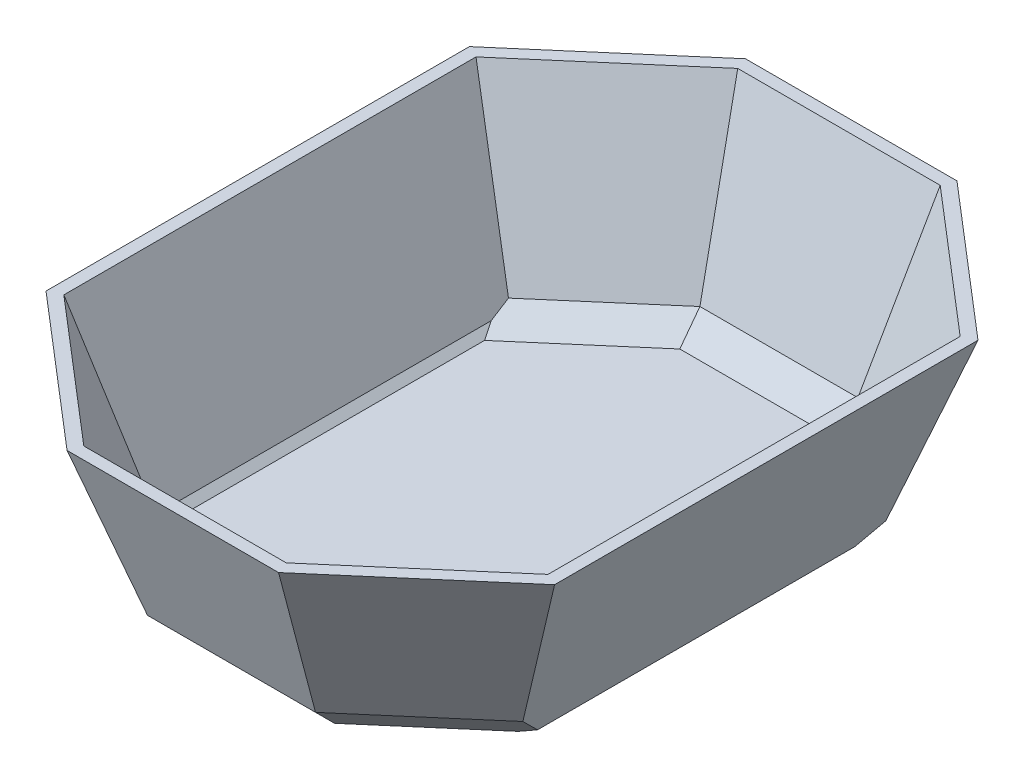
ISO-10303-21;
HEADER;
FILE_DESCRIPTION(('STEP AP214'),'2;1');
FILE_NAME('part.step','',(''),(''),'','','');
FILE_SCHEMA(('AUTOMOTIVE_DESIGN { 1 0 10303 214 1 1 1 1 }'));
ENDSEC;
DATA;
#1=APPLICATION_CONTEXT('core data for automotive mechanical design processes');
#2=APPLICATION_PROTOCOL_DEFINITION('international standard','automotive_design',2000,#1);
#3=PRODUCT_CONTEXT('',#1,'mechanical');
#4=PRODUCT('Part','Part','',(#3));
#5=PRODUCT_RELATED_PRODUCT_CATEGORY('part','',(#4));
#6=PRODUCT_DEFINITION_FORMATION('','',#4);
#7=PRODUCT_DEFINITION_CONTEXT('part definition',#1,'design');
#8=PRODUCT_DEFINITION('design','',#6,#7);
#9=PRODUCT_DEFINITION_SHAPE('','',#8);
#10=(LENGTH_UNIT() NAMED_UNIT(*) SI_UNIT(.MILLI.,.METRE.));
#11=(NAMED_UNIT(*) PLANE_ANGLE_UNIT() SI_UNIT($,.RADIAN.));
#12=(NAMED_UNIT(*) SI_UNIT($,.STERADIAN.) SOLID_ANGLE_UNIT());
#13=UNCERTAINTY_MEASURE_WITH_UNIT(LENGTH_MEASURE(1.E-05),#10,'distance_accuracy_value','');
#14=(GEOMETRIC_REPRESENTATION_CONTEXT(3) GLOBAL_UNCERTAINTY_ASSIGNED_CONTEXT((#13)) GLOBAL_UNIT_ASSIGNED_CONTEXT((#10,
#11,#12)) REPRESENTATION_CONTEXT('',''));
#15=CARTESIAN_POINT('',(0.,0.,0.));
#16=DIRECTION('',(0.,0.,1.));
#17=DIRECTION('',(1.,0.,0.));
#18=AXIS2_PLACEMENT_3D('',#15,#16,#17);
#19=CARTESIAN_POINT('',(0.,50.,0.));
#20=DIRECTION('',(0.,1.,0.));
#21=DIRECTION('',(0.,0.,1.));
#22=AXIS2_PLACEMENT_3D('',#19,#20,#21);
#23=PLANE('',#22);
#24=DIRECTION('',(0.,0.,1.));
#25=VECTOR('',#24,1.);
#26=CARTESIAN_POINT('',(66.4232600357115,50.,0.));
#27=LINE('',#26,#25);
#28=CARTESIAN_POINT('',(66.4232600357115,50.,-55.2960015343811));
#29=VERTEX_POINT('',#28);
#30=CARTESIAN_POINT('',(66.4232600357115,50.,55.296001534381));
#31=VERTEX_POINT('',#30);
#32=EDGE_CURVE('E354',#29,#31,#27,.T.);
#33=ORIENTED_EDGE('',*,*,#32,.F.);
#34=DIRECTION('',(0.75883467283237,0.,0.65128330187975));
#35=VECTOR('',#34,1.);
#36=CARTESIAN_POINT('',(55.5029382979195,50.,-64.6685611361081));
#37=LINE('',#36,#35);
#38=CARTESIAN_POINT('',(27.6218108773244,50.,-88.5980327018157));
#39=VERTEX_POINT('',#38);
#40=EDGE_CURVE('E358',#39,#29,#37,.T.);
#41=ORIENTED_EDGE('',*,*,#40,.F.);
#42=DIRECTION('',(1.,0.,0.));
#43=VECTOR('',#42,1.);
#44=CARTESIAN_POINT('',(0.,50.,-88.5980327018157));
#45=LINE('',#44,#43);
#46=CARTESIAN_POINT('',(-27.6218108773244,50.,-88.5980327018157));
#47=VERTEX_POINT('',#46);
#48=EDGE_CURVE('E363',#47,#39,#45,.T.);
#49=ORIENTED_EDGE('',*,*,#48,.F.);
#50=DIRECTION('',(0.75883467283237,0.,-0.65128330187975));
#51=VECTOR('',#50,1.);
#52=CARTESIAN_POINT('',(-55.5029382979195,50.,-64.6685611361081));
#53=LINE('',#52,#51);
#54=CARTESIAN_POINT('',(-66.4232600357115,50.,-55.2960015343811));
#55=VERTEX_POINT('',#54);
#56=EDGE_CURVE('E367',#55,#47,#53,.T.);
#57=ORIENTED_EDGE('',*,*,#56,.F.);
#58=DIRECTION('',(0.,0.,-1.));
#59=VECTOR('',#58,1.);
#60=CARTESIAN_POINT('',(-66.4232600357115,50.,0.));
#61=LINE('',#60,#59);
#62=CARTESIAN_POINT('',(-66.4232600357115,50.,55.296001534381));
#63=VERTEX_POINT('',#62);
#64=EDGE_CURVE('E349',#55,#63,#61,.F.);
#65=ORIENTED_EDGE('',*,*,#64,.T.);
#66=DIRECTION('',(-0.758834672832369,0.,-0.651283301879752));
#67=VECTOR('',#66,1.);
#68=CARTESIAN_POINT('',(-55.5029382979196,50.,64.6685611361079));
#69=LINE('',#68,#67);
#70=CARTESIAN_POINT('',(-27.6218108773245,50.,88.5980327018156));
#71=VERTEX_POINT('',#70);
#72=EDGE_CURVE('E345',#63,#71,#69,.F.);
#73=ORIENTED_EDGE('',*,*,#72,.T.);
#74=DIRECTION('',(-1.,0.,0.));
#75=VECTOR('',#74,1.);
#76=CARTESIAN_POINT('',(0.,50.,88.5980327018156));
#77=LINE('',#76,#75);
#78=CARTESIAN_POINT('',(27.6218108773244,50.,88.5980327018157));
#79=VERTEX_POINT('',#78);
#80=EDGE_CURVE('E348',#71,#79,#77,.F.);
#81=ORIENTED_EDGE('',*,*,#80,.T.);
#82=DIRECTION('',(-0.75883467283237,0.,0.65128330187975));
#83=VECTOR('',#82,1.);
#84=CARTESIAN_POINT('',(55.5029382979195,50.,64.668561136108));
#85=LINE('',#84,#83);
#86=EDGE_CURVE('E341',#79,#31,#85,.F.);
#87=ORIENTED_EDGE('',*,*,#86,.T.);
#88=EDGE_LOOP('',(#33,#41,#49,#57,#65,#73,#81,#87));
#89=FACE_BOUND('',#88,.T.);
#90=DIRECTION('',(0.75883467283237,0.,0.65128330187975));
#91=VECTOR('',#90,1.);
#92=CARTESIAN_POINT('',(53.4236946575841,50.,-62.2459561606714));
#93=LINE('',#92,#91);
#94=CARTESIAN_POINT('',(26.4396397088501,50.,-85.405499384388));
#95=VERTEX_POINT('',#94);
#96=CARTESIAN_POINT('',(63.2307267182838,50.,-53.8288971479449));
#97=VERTEX_POINT('',#96);
#98=EDGE_CURVE('E285',#95,#97,#93,.T.);
#99=ORIENTED_EDGE('',*,*,#98,.T.);
#100=DIRECTION('',(0.,0.,1.));
#101=VECTOR('',#100,1.);
#102=CARTESIAN_POINT('',(63.2307267182838,50.,0.));
#103=LINE('',#102,#101);
#104=CARTESIAN_POINT('',(63.2307267182838,50.,53.8288971479448));
#105=VERTEX_POINT('',#104);
#106=EDGE_CURVE('E281',#97,#105,#103,.T.);
#107=ORIENTED_EDGE('',*,*,#106,.T.);
#108=DIRECTION('',(-0.75883467283237,0.,0.65128330187975));
#109=VECTOR('',#108,1.);
#110=CARTESIAN_POINT('',(53.423694657584,50.,62.2459561606713));
#111=LINE('',#110,#109);
#112=CARTESIAN_POINT('',(26.43963970885,50.,85.4054993843879));
#113=VERTEX_POINT('',#112);
#114=EDGE_CURVE('E307',#113,#105,#111,.F.);
#115=ORIENTED_EDGE('',*,*,#114,.F.);
#116=DIRECTION('',(-1.,0.,0.));
#117=VECTOR('',#116,1.);
#118=CARTESIAN_POINT('',(0.,50.,85.4054993843879));
#119=LINE('',#118,#117);
#120=CARTESIAN_POINT('',(-26.4396397088501,50.,85.4054993843879));
#121=VERTEX_POINT('',#120);
#122=EDGE_CURVE('E304',#121,#113,#119,.F.);
#123=ORIENTED_EDGE('',*,*,#122,.F.);
#124=DIRECTION('',(-0.758834672832369,0.,-0.651283301879752));
#125=VECTOR('',#124,1.);
#126=CARTESIAN_POINT('',(-53.4236946575841,50.,62.2459561606712));
#127=LINE('',#126,#125);
#128=CARTESIAN_POINT('',(-63.2307267182838,50.,53.8288971479447));
#129=VERTEX_POINT('',#128);
#130=EDGE_CURVE('E301',#129,#121,#127,.F.);
#131=ORIENTED_EDGE('',*,*,#130,.F.);
#132=DIRECTION('',(0.,0.,-1.));
#133=VECTOR('',#132,1.);
#134=CARTESIAN_POINT('',(-63.2307267182838,50.,0.));
#135=LINE('',#134,#133);
#136=CARTESIAN_POINT('',(-63.2307267182838,50.,-53.8288971479449));
#137=VERTEX_POINT('',#136);
#138=EDGE_CURVE('E298',#137,#129,#135,.F.);
#139=ORIENTED_EDGE('',*,*,#138,.F.);
#140=DIRECTION('',(0.75883467283237,0.,-0.65128330187975));
#141=VECTOR('',#140,1.);
#142=CARTESIAN_POINT('',(-53.4236946575841,50.,-62.2459561606714));
#143=LINE('',#142,#141);
#144=CARTESIAN_POINT('',(-26.4396397088501,50.,-85.405499384388));
#145=VERTEX_POINT('',#144);
#146=EDGE_CURVE('E294',#137,#145,#143,.T.);
#147=ORIENTED_EDGE('',*,*,#146,.T.);
#148=DIRECTION('',(1.,0.,0.));
#149=VECTOR('',#148,1.);
#150=CARTESIAN_POINT('',(0.,50.,-85.405499384388));
#151=LINE('',#150,#149);
#152=EDGE_CURVE('E290',#145,#95,#151,.T.);
#153=ORIENTED_EDGE('',*,*,#152,.T.);
#154=EDGE_LOOP('',(#99,#107,#115,#123,#131,#139,#147,#153));
#155=FACE_BOUND('',#154,.T.);
#156=ADVANCED_FACE('F47',(#89,#155),#23,.T.);
#157=CARTESIAN_POINT('',(48.2247483224014,0.,0.));
#158=DIRECTION('',(0.939692620785908,-0.342020143325669,0.));
#159=DIRECTION('',(0.342020143325669,0.939692620785908,0.));
#160=AXIS2_PLACEMENT_3D('',#157,#158,#159);
#161=PLANE('',#160);
#162=DIRECTION('',(-0.248610057653061,-0.683050519651096,-0.686756890637516));
#163=VECTOR('',#162,1.);
#164=CARTESIAN_POINT('',(41.3366350263839,-18.9249357434531,21.316337174256));
#165=LINE('',#164,#163);
#166=CARTESIAN_POINT('',(51.0860156236753,7.86126730127392,48.2478876024416));
#167=VERTEX_POINT('',#166);
#168=CARTESIAN_POINT('',(48.9087886090527,1.87938524157184,42.233546634544));
#169=VERTEX_POINT('',#168);
#170=EDGE_CURVE('E392',#167,#169,#165,.T.);
#171=ORIENTED_EDGE('',*,*,#170,.T.);
#172=DIRECTION('',(0.,0.,-1.));
#173=VECTOR('',#172,1.);
#174=CARTESIAN_POINT('',(48.9087886090527,1.87938524157184,-35.9084967621453));
#175=LINE('',#174,#173);
#176=CARTESIAN_POINT('',(48.9087886090527,1.87938524157185,-40.6326491614614));
#177=VERTEX_POINT('',#176);
#178=EDGE_CURVE('E57',#169,#177,#175,.T.);
#179=ORIENTED_EDGE('',*,*,#178,.T.);
#180=DIRECTION('',(0.133339372895486,0.366346916154587,-0.920874882196198));
#181=VECTOR('',#180,1.);
#182=CARTESIAN_POINT('',(43.8155842473697,-12.1140787348201,-5.45771272132757));
#183=LINE('',#182,#181);
#184=CARTESIAN_POINT('',(49.9348490390297,4.69846310392956,-47.7188777604354));
#185=VERTEX_POINT('',#184);
#186=EDGE_CURVE('E395',#177,#185,#183,.T.);
#187=ORIENTED_EDGE('',*,*,#186,.T.);
#188=DIRECTION('',(-0.337872326797718,-0.928296588535319,0.155266656104858));
#189=VECTOR('',#188,1.);
#190=CARTESIAN_POINT('',(47.9085216457583,-0.868825653506048,-46.7876944300074));
#191=LINE('',#190,#189);
#192=EDGE_CURVE('E332',#29,#185,#191,.T.);
#193=ORIENTED_EDGE('',*,*,#192,.F.);
#194=ORIENTED_EDGE('',*,*,#32,.T.);
#195=DIRECTION('',(0.337872326797717,0.928296588535319,0.155266656104858));
#196=VECTOR('',#195,1.);
#197=CARTESIAN_POINT('',(47.9085216457583,-0.868825653506054,46.7876944300073));
#198=LINE('',#197,#196);
#199=EDGE_CURVE('E337',#31,#167,#198,.F.);
#200=ORIENTED_EDGE('',*,*,#199,.T.);
#201=EDGE_LOOP('',(#171,#179,#187,#193,#194,#200));
#202=FACE_BOUND('',#201,.T.);
#203=ADVANCED_FACE('F462',(#202),#161,.T.);
#204=CARTESIAN_POINT('',(43.6505514999776,0.,-50.8588994541023));
#205=DIRECTION('',(0.612006112817482,-0.342020143325669,-0.713071342457067));
#206=DIRECTION('',(-0.75883467283237,0.,-0.65128330187975));
#207=AXIS2_PLACEMENT_3D('',#204,#205,#206);
#208=PLANE('',#207);
#209=ORIENTED_EDGE('',*,*,#192,.T.);
#210=DIRECTION('',(-0.75883467283237,0.,-0.65128330187975));
#211=VECTOR('',#210,1.);
#212=CARTESIAN_POINT('',(21.9967983773125,4.69846310392955,-71.6972047063186));
#213=LINE('',#212,#211);
#214=CARTESIAN_POINT('',(21.5162758190599,4.69846310392956,-72.1096217051339));
#215=VERTEX_POINT('',#214);
#216=EDGE_CURVE('E398',#185,#215,#213,.T.);
#217=ORIENTED_EDGE('',*,*,#216,.T.);
#218=DIRECTION('',(-0.125643867089277,-0.932245941820491,0.339309773838121));
#219=VECTOR('',#218,1.);
#220=CARTESIAN_POINT('',(20.5533707293889,-2.44605085444957,-69.5092312859845));
#221=LINE('',#220,#219);
#222=EDGE_CURVE('E328',#39,#215,#221,.T.);
#223=ORIENTED_EDGE('',*,*,#222,.F.);
#224=ORIENTED_EDGE('',*,*,#40,.T.);
#225=EDGE_LOOP('',(#209,#217,#223,#224));
#226=FACE_BOUND('',#225,.T.);
#227=ADVANCED_FACE('F479',(#226),#208,.T.);
#228=CARTESIAN_POINT('',(0.,0.,-70.3995209885055));
#229=DIRECTION('',(0.,-0.342020143325669,-0.939692620785908));
#230=DIRECTION('',(0.,0.939692620785908,-0.342020143325669));
#231=AXIS2_PLACEMENT_3D('',#228,#229,#230);
#232=PLANE('',#231);
#233=ORIENTED_EDGE('',*,*,#222,.T.);
#234=DIRECTION('',(-1.,0.,0.));
#235=VECTOR('',#234,1.);
#236=CARTESIAN_POINT('',(-20.8830383360399,4.69846310392956,-72.1096217051339));
#237=LINE('',#236,#235);
#238=CARTESIAN_POINT('',(-21.5162758190599,4.69846310392956,-72.1096217051339));
#239=VERTEX_POINT('',#238);
#240=EDGE_CURVE('E401',#215,#239,#237,.T.);
#241=ORIENTED_EDGE('',*,*,#240,.T.);
#242=DIRECTION('',(0.125643867089277,-0.932245941820491,0.339309773838121));
#243=VECTOR('',#242,1.);
#244=CARTESIAN_POINT('',(-20.4093954494241,-3.51431127637887,-69.1204162899576));
#245=LINE('',#244,#243);
#246=EDGE_CURVE('E324',#47,#239,#245,.T.);
#247=ORIENTED_EDGE('',*,*,#246,.F.);
#248=ORIENTED_EDGE('',*,*,#48,.T.);
#249=EDGE_LOOP('',(#233,#241,#247,#248));
#250=FACE_BOUND('',#249,.T.);
#251=ADVANCED_FACE('F482',(#250),#232,.T.);
#252=CARTESIAN_POINT('',(-43.6505514999776,0.,-50.8588994541023));
#253=DIRECTION('',(-0.612006112817482,-0.342020143325669,-0.713071342457067));
#254=DIRECTION('',(-0.75883467283237,0.,0.65128330187975));
#255=AXIS2_PLACEMENT_3D('',#252,#253,#254);
#256=PLANE('',#255);
#257=ORIENTED_EDGE('',*,*,#246,.T.);
#258=DIRECTION('',(-0.75883467283237,0.,0.65128330187975));
#259=VECTOR('',#258,1.);
#260=CARTESIAN_POINT('',(-49.338508363674,4.69846310392956,-48.2306977101501));
#261=LINE('',#260,#259);
#262=CARTESIAN_POINT('',(-49.9348490390297,4.69846310392956,-47.7188777604354));
#263=VERTEX_POINT('',#262);
#264=EDGE_CURVE('E404',#239,#263,#261,.T.);
#265=ORIENTED_EDGE('',*,*,#264,.T.);
#266=DIRECTION('',(-0.337872326797718,0.928296588535319,-0.155266656104858));
#267=VECTOR('',#266,1.);
#268=CARTESIAN_POINT('',(-47.9085216457583,-0.868825653506048,-46.7876944300074));
#269=LINE('',#268,#267);
#270=EDGE_CURVE('E320',#55,#263,#269,.F.);
#271=ORIENTED_EDGE('',*,*,#270,.F.);
#272=ORIENTED_EDGE('',*,*,#56,.T.);
#273=EDGE_LOOP('',(#257,#265,#271,#272));
#274=FACE_BOUND('',#273,.T.);
#275=ADVANCED_FACE('F489',(#274),#256,.T.);
#276=CARTESIAN_POINT('',(-48.2247483224014,0.,0.));
#277=DIRECTION('',(-0.939692620785908,-0.342020143325669,0.));
#278=DIRECTION('',(0.342020143325669,-0.939692620785908,0.));
#279=AXIS2_PLACEMENT_3D('',#276,#277,#278);
#280=PLANE('',#279);
#281=DIRECTION('',(-0.133339372895486,0.366346916154587,-0.920874882196198));
#282=VECTOR('',#281,1.);
#283=CARTESIAN_POINT('',(-49.1027998441334,2.41242672907649,-41.9725390182232));
#284=LINE('',#283,#282);
#285=CARTESIAN_POINT('',(-49.3692552429109,3.14450692050958,-43.8127462925753));
#286=VERTEX_POINT('',#285);
#287=EDGE_CURVE('E410',#263,#286,#284,.F.);
#288=ORIENTED_EDGE('',*,*,#287,.T.);
#289=DIRECTION('',(0.,0.,-1.));
#290=VECTOR('',#289,1.);
#291=CARTESIAN_POINT('',(-49.3692552429109,3.14450692050958,0.));
#292=LINE('',#291,#290);
#293=CARTESIAN_POINT('',(-49.3692552429109,3.14450692050958,43.5055331209157));
#294=VERTEX_POINT('',#293);
#295=EDGE_CURVE('E424',#286,#294,#292,.F.);
#296=ORIENTED_EDGE('',*,*,#295,.T.);
#297=DIRECTION('',(0.248610057653061,-0.683050519651096,-0.686756890637516));
#298=VECTOR('',#297,1.);
#299=CARTESIAN_POINT('',(-51.5581234712822,9.15837295212142,49.5520316122571));
#300=LINE('',#299,#298);
#301=CARTESIAN_POINT('',(-51.0860156236753,7.86126730127393,48.2478876024416));
#302=VERTEX_POINT('',#301);
#303=EDGE_CURVE('E407',#294,#302,#300,.F.);
#304=ORIENTED_EDGE('',*,*,#303,.T.);
#305=DIRECTION('',(0.337872326797718,-0.92829658853532,-0.155266656104858));
#306=VECTOR('',#305,1.);
#307=CARTESIAN_POINT('',(-47.9085216457583,-0.868825653506038,46.7876944300073));
#308=LINE('',#307,#306);
#309=EDGE_CURVE('E315',#63,#302,#308,.T.);
#310=ORIENTED_EDGE('',*,*,#309,.F.);
#311=ORIENTED_EDGE('',*,*,#64,.F.);
#312=ORIENTED_EDGE('',*,*,#270,.T.);
#313=EDGE_LOOP('',(#288,#296,#304,#310,#311,#312));
#314=FACE_BOUND('',#313,.T.);
#315=ADVANCED_FACE('F495',(#314),#280,.T.);
#316=CARTESIAN_POINT('',(-43.6505514999776,0.,50.8588994541022));
#317=DIRECTION('',(-0.612006112817484,-0.342020143325669,0.713071342457066));
#318=DIRECTION('',(0.758834672832369,0.,0.651283301879752));
#319=AXIS2_PLACEMENT_3D('',#316,#317,#318);
#320=PLANE('',#319);
#321=ORIENTED_EDGE('',*,*,#309,.T.);
#322=DIRECTION('',(-0.758834672832369,0.,-0.651283301879752));
#323=VECTOR('',#322,1.);
#324=CARTESIAN_POINT('',(-45.5140471155119,7.86126730127393,53.0301282905503));
#325=LINE('',#324,#323);
#326=CARTESIAN_POINT('',(-21.9425441806304,7.86126730127394,73.2607882897794));
#327=VERTEX_POINT('',#326);
#328=EDGE_CURVE('E414',#302,#327,#325,.F.);
#329=ORIENTED_EDGE('',*,*,#328,.T.);
#330=DIRECTION('',(0.125643867089278,-0.932245941820491,-0.339309773838121));
#331=VECTOR('',#330,1.);
#332=CARTESIAN_POINT('',(-20.5533707293889,-2.44605085444957,69.5092312859844));
#333=LINE('',#332,#331);
#334=EDGE_CURVE('E311',#71,#327,#333,.T.);
#335=ORIENTED_EDGE('',*,*,#334,.F.);
#336=ORIENTED_EDGE('',*,*,#72,.F.);
#337=EDGE_LOOP('',(#321,#329,#335,#336));
#338=FACE_BOUND('',#337,.T.);
#339=ADVANCED_FACE('F501',(#338),#320,.T.);
#340=CARTESIAN_POINT('',(0.,0.,70.3995209885055));
#341=DIRECTION('',(0.,-0.342020143325669,0.939692620785908));
#342=DIRECTION('',(0.,-0.939692620785908,-0.342020143325669));
#343=AXIS2_PLACEMENT_3D('',#340,#341,#342);
#344=PLANE('',#343);
#345=ORIENTED_EDGE('',*,*,#334,.T.);
#346=DIRECTION('',(-1.,0.,0.));
#347=VECTOR('',#346,1.);
#348=CARTESIAN_POINT('',(0.,7.86126730127394,73.2607882897794));
#349=LINE('',#348,#347);
#350=CARTESIAN_POINT('',(21.9425441806303,7.86126730127392,73.2607882897794));
#351=VERTEX_POINT('',#350);
#352=EDGE_CURVE('E418',#327,#351,#349,.F.);
#353=ORIENTED_EDGE('',*,*,#352,.T.);
#354=DIRECTION('',(-0.125643867089277,-0.932245941820491,-0.339309773838121));
#355=VECTOR('',#354,1.);
#356=CARTESIAN_POINT('',(20.4093954494241,-3.51431127637887,69.1204162899575));
#357=LINE('',#356,#355);
#358=EDGE_CURVE('E316',#79,#351,#357,.T.);
#359=ORIENTED_EDGE('',*,*,#358,.F.);
#360=ORIENTED_EDGE('',*,*,#80,.F.);
#361=EDGE_LOOP('',(#345,#353,#359,#360));
#362=FACE_BOUND('',#361,.T.);
#363=ADVANCED_FACE('F504',(#362),#344,.T.);
#364=CARTESIAN_POINT('',(43.6505514999775,0.,50.8588994541023));
#365=DIRECTION('',(0.612006112817483,-0.342020143325669,0.713071342457067));
#366=DIRECTION('',(0.75883467283237,0.,-0.65128330187975));
#367=AXIS2_PLACEMENT_3D('',#364,#365,#366);
#368=PLANE('',#367);
#369=ORIENTED_EDGE('',*,*,#358,.T.);
#370=DIRECTION('',(-0.75883467283237,0.,0.651283301879751));
#371=VECTOR('',#370,1.);
#372=CARTESIAN_POINT('',(45.5140471155118,7.86126730127392,53.0301282905504));
#373=LINE('',#372,#371);
#374=EDGE_CURVE('E421',#351,#167,#373,.F.);
#375=ORIENTED_EDGE('',*,*,#374,.T.);
#376=ORIENTED_EDGE('',*,*,#199,.F.);
#377=ORIENTED_EDGE('',*,*,#86,.F.);
#378=EDGE_LOOP('',(#369,#375,#376,#377));
#379=FACE_BOUND('',#378,.T.);
#380=ADVANCED_FACE('F508',(#379),#368,.T.);
#381=CARTESIAN_POINT('',(0.,0.,0.));
#382=DIRECTION('',(0.,1.,0.));
#383=DIRECTION('',(0.,0.,1.));
#384=AXIS2_PLACEMENT_3D('',#381,#382,#383);
#385=PLANE('',#384);
#386=DIRECTION('',(-0.758834672832369,0.,-0.651283301879752));
#387=VECTOR('',#386,1.);
#388=CARTESIAN_POINT('',(-40.3941349905789,0.,47.0647260899404));
#389=LINE('',#388,#387);
#390=CARTESIAN_POINT('',(-19.0315757968379,0.,65.3995209885054));
#391=VERTEX_POINT('',#390);
#392=CARTESIAN_POINT('',(-46.2247483224013,0.,42.060498899636));
#393=VERTEX_POINT('',#392);
#394=EDGE_CURVE('E378',#391,#393,#389,.T.);
#395=ORIENTED_EDGE('',*,*,#394,.T.);
#396=DIRECTION('',(0.,0.,-1.));
#397=VECTOR('',#396,1.);
#398=CARTESIAN_POINT('',(-46.2247483224013,0.,0.));
#399=LINE('',#398,#397);
#400=CARTESIAN_POINT('',(-46.2247483224013,0.,-37.6250321952161));
#401=VERTEX_POINT('',#400);
#402=EDGE_CURVE('E445',#393,#401,#399,.T.);
#403=ORIENTED_EDGE('',*,*,#402,.T.);
#404=DIRECTION('',(0.75883467283237,0.,-0.65128330187975));
#405=VECTOR('',#404,1.);
#406=CARTESIAN_POINT('',(-15.4345416556563,0.,-64.0512725627375));
#407=LINE('',#406,#405);
#408=CARTESIAN_POINT('',(-17.7852504856278,0.,-62.0337350629982));
#409=VERTEX_POINT('',#408);
#410=EDGE_CURVE('E382',#401,#409,#407,.T.);
#411=ORIENTED_EDGE('',*,*,#410,.T.);
#412=DIRECTION('',(1.,0.,0.));
#413=VECTOR('',#412,1.);
#414=CARTESIAN_POINT('',(20.8830383360399,0.,-62.0337350629982));
#415=LINE('',#414,#413);
#416=CARTESIAN_POINT('',(17.7852504856278,0.,-62.0337350629982));
#417=VERTEX_POINT('',#416);
#418=EDGE_CURVE('E385',#409,#417,#415,.T.);
#419=ORIENTED_EDGE('',*,*,#418,.T.);
#420=DIRECTION('',(0.75883467283237,0.,0.65128330187975));
#421=VECTOR('',#420,1.);
#422=CARTESIAN_POINT('',(42.7762516420178,0.,-40.584765566569));
#423=LINE('',#422,#421);
#424=CARTESIAN_POINT('',(44.8784339521984,0.,-38.7805303554691));
#425=VERTEX_POINT('',#424);
#426=EDGE_CURVE('E388',#417,#425,#423,.T.);
#427=ORIENTED_EDGE('',*,*,#426,.T.);
#428=DIRECTION('',(0.,0.,1.));
#429=VECTOR('',#428,1.);
#430=CARTESIAN_POINT('',(44.8784339521984,0.,40.3439634665651));
#431=LINE('',#430,#429);
#432=CARTESIAN_POINT('',(44.8784339521984,0.,43.2159970598889));
#433=VERTEX_POINT('',#432);
#434=EDGE_CURVE('E441',#425,#433,#431,.T.);
#435=ORIENTED_EDGE('',*,*,#434,.T.);
#436=DIRECTION('',(-0.75883467283237,0.,0.65128330187975));
#437=VECTOR('',#436,1.);
#438=CARTESIAN_POINT('',(40.3941349905788,0.,47.0647260899404));
#439=LINE('',#438,#437);
#440=CARTESIAN_POINT('',(19.0315757968378,0.,65.3995209885055));
#441=VERTEX_POINT('',#440);
#442=EDGE_CURVE('E336',#433,#441,#439,.T.);
#443=ORIENTED_EDGE('',*,*,#442,.T.);
#444=DIRECTION('',(-1.,0.,0.));
#445=VECTOR('',#444,1.);
#446=CARTESIAN_POINT('',(0.,0.,65.3995209885054));
#447=LINE('',#446,#445);
#448=EDGE_CURVE('E375',#441,#391,#447,.T.);
#449=ORIENTED_EDGE('',*,*,#448,.T.);
#450=EDGE_LOOP('',(#395,#403,#411,#419,#427,#435,#443,#449));
#451=FACE_BOUND('',#450,.T.);
#452=ADVANCED_FACE('F470',(#451),#385,.F.);
#453=CARTESIAN_POINT('',(-38.202054819594,0.,-44.5106510283343));
#454=DIRECTION('',(-0.275244216941164,-0.90630778703665,-0.320697390380989));
#455=DIRECTION('',(-0.75883467283237,0.,0.65128330187975));
#456=AXIS2_PLACEMENT_3D('',#453,#454,#455);
#457=PLANE('',#456);
#458=ORIENTED_EDGE('',*,*,#410,.F.);
#459=DIRECTION('',(-0.412667603641187,0.412667603641184,-0.812041192187984));
#460=VECTOR('',#459,1.);
#461=CARTESIAN_POINT('',(-47.1659195008508,0.941171178449443,-39.4770548862573));
#462=LINE('',#461,#460);
#463=EDGE_CURVE('E448',#401,#286,#462,.T.);
#464=ORIENTED_EDGE('',*,*,#463,.T.);
#465=ORIENTED_EDGE('',*,*,#287,.F.);
#466=ORIENTED_EDGE('',*,*,#264,.F.);
#467=DIRECTION('',(0.318160237427564,-0.400657728934743,0.859213272456199));
#468=VECTOR('',#467,1.);
#469=CARTESIAN_POINT('',(-15.06171897513,-3.42973074982919,-54.678653734505));
#470=LINE('',#469,#468);
#471=EDGE_CURVE('E359',#409,#239,#470,.F.);
#472=ORIENTED_EDGE('',*,*,#471,.F.);
#473=EDGE_LOOP('',(#458,#464,#465,#466,#472));
#474=FACE_BOUND('',#473,.T.);
#475=ADVANCED_FACE('F523',(#474),#457,.T.);
#476=CARTESIAN_POINT('',(0.,0.,-62.0337350629982));
#477=DIRECTION('',(0.,-0.90630778703665,-0.4226182617407));
#478=DIRECTION('',(-1.,0.,0.));
#479=AXIS2_PLACEMENT_3D('',#476,#477,#478);
#480=PLANE('',#479);
#481=ORIENTED_EDGE('',*,*,#471,.T.);
#482=ORIENTED_EDGE('',*,*,#240,.F.);
#483=DIRECTION('',(-0.318160237427564,-0.400657728934743,0.859213272456199));
#484=VECTOR('',#483,1.);
#485=CARTESIAN_POINT('',(15.9849218461324,-2.26714560520986,-57.1718256228228));
#486=LINE('',#485,#484);
#487=EDGE_CURVE('E425',#417,#215,#486,.F.);
#488=ORIENTED_EDGE('',*,*,#487,.F.);
#489=ORIENTED_EDGE('',*,*,#418,.F.);
#490=EDGE_LOOP('',(#481,#482,#488,#489));
#491=FACE_BOUND('',#490,.T.);
#492=ADVANCED_FACE('F477',(#491),#480,.T.);
#493=CARTESIAN_POINT('',(38.202054819594,0.,-44.5106510283343));
#494=DIRECTION('',(0.275244216941164,-0.90630778703665,-0.320697390380989));
#495=DIRECTION('',(-0.75883467283237,0.,-0.65128330187975));
#496=AXIS2_PLACEMENT_3D('',#493,#494,#495);
#497=PLANE('',#496);
#498=ORIENTED_EDGE('',*,*,#186,.F.);
#499=DIRECTION('',(-0.836645206627429,-0.390134067009043,0.384473936680147));
#500=VECTOR('',#499,1.);
#501=CARTESIAN_POINT('',(42.0483321609821,-1.31969813860235,-37.4799786182988));
#502=LINE('',#501,#500);
#503=EDGE_CURVE('E11',#177,#425,#502,.T.);
#504=ORIENTED_EDGE('',*,*,#503,.T.);
#505=ORIENTED_EDGE('',*,*,#426,.F.);
#506=ORIENTED_EDGE('',*,*,#487,.T.);
#507=ORIENTED_EDGE('',*,*,#216,.F.);
#508=EDGE_LOOP('',(#498,#504,#505,#506,#507));
#509=FACE_BOUND('',#508,.T.);
#510=ADVANCED_FACE('F467',(#509),#497,.T.);
#511=CARTESIAN_POINT('',(45.5140471155118,7.86126730127393,53.0301282905504));
#512=DIRECTION('',(0.460526839232737,-0.707106781186548,0.536577142959244));
#513=DIRECTION('',(-0.75883467283237,0.,0.65128330187975));
#514=AXIS2_PLACEMENT_3D('',#511,#512,#513);
#515=PLANE('',#514);
#516=ORIENTED_EDGE('',*,*,#442,.F.);
#517=DIRECTION('',(0.884968531878612,0.412667603641184,-0.215722382912984));
#518=VECTOR('',#517,1.);
#519=CARTESIAN_POINT('',(46.3735530752197,0.697185496918854,42.8515426772317));
#520=LINE('',#519,#518);
#521=EDGE_CURVE('E451',#433,#169,#520,.T.);
#522=ORIENTED_EDGE('',*,*,#521,.T.);
#523=ORIENTED_EDGE('',*,*,#170,.F.);
#524=ORIENTED_EDGE('',*,*,#374,.F.);
#525=DIRECTION('',(-0.253297452597826,-0.684046928400183,-0.684046928400184));
#526=VECTOR('',#525,1.);
#527=CARTESIAN_POINT('',(19.9495696344164,2.47910454071153,67.878625529217));
#528=LINE('',#527,#526);
#529=EDGE_CURVE('E266',#441,#351,#528,.F.);
#530=ORIENTED_EDGE('',*,*,#529,.F.);
#531=EDGE_LOOP('',(#516,#522,#523,#524,#530));
#532=FACE_BOUND('',#531,.T.);
#533=ADVANCED_FACE('F457',(#532),#515,.T.);
#534=CARTESIAN_POINT('',(0.,7.86126730127393,73.2607882897794));
#535=DIRECTION('',(0.,-0.707106781186548,0.707106781186547));
#536=DIRECTION('',(-1.,0.,0.));
#537=AXIS2_PLACEMENT_3D('',#534,#535,#536);
#538=PLANE('',#537);
#539=ORIENTED_EDGE('',*,*,#529,.T.);
#540=ORIENTED_EDGE('',*,*,#352,.F.);
#541=DIRECTION('',(0.253297452597826,-0.684046928400183,-0.684046928400184));
#542=VECTOR('',#541,1.);
#543=CARTESIAN_POINT('',(-20.5347193341536,4.05934094125271,69.4588619297581));
#544=LINE('',#543,#542);
#545=EDGE_CURVE('E263',#391,#327,#544,.F.);
#546=ORIENTED_EDGE('',*,*,#545,.F.);
#547=ORIENTED_EDGE('',*,*,#448,.F.);
#548=EDGE_LOOP('',(#539,#540,#546,#547));
#549=FACE_BOUND('',#548,.T.);
#550=ADVANCED_FACE('F511',(#549),#538,.T.);
#551=CARTESIAN_POINT('',(-45.5140471155119,7.86126730127393,53.0301282905503));
#552=DIRECTION('',(-0.460526839232738,-0.707106781186547,0.536577142959243));
#553=DIRECTION('',(-0.758834672832369,0.,-0.651283301879752));
#554=AXIS2_PLACEMENT_3D('',#551,#552,#553);
#555=PLANE('',#554);
#556=ORIENTED_EDGE('',*,*,#303,.F.);
#557=DIRECTION('',(0.672493404147249,-0.672493404147243,-0.309039225272291));
#558=VECTOR('',#557,1.);
#559=CARTESIAN_POINT('',(-51.7383565133152,5.51360819091384,44.5942355775974));
#560=LINE('',#559,#558);
#561=EDGE_CURVE('E438',#294,#393,#560,.T.);
#562=ORIENTED_EDGE('',*,*,#561,.T.);
#563=ORIENTED_EDGE('',*,*,#394,.F.);
#564=ORIENTED_EDGE('',*,*,#545,.T.);
#565=ORIENTED_EDGE('',*,*,#328,.F.);
#566=EDGE_LOOP('',(#556,#562,#563,#564,#565));
#567=FACE_BOUND('',#566,.T.);
#568=ADVANCED_FACE('F517',(#567),#555,.T.);
#569=CARTESIAN_POINT('',(-49.3692552429109,3.14450692050958,0.));
#570=DIRECTION('',(-0.707106781186544,-0.707106781186551,0.));
#571=DIRECTION('',(0.,0.,-1.));
#572=AXIS2_PLACEMENT_3D('',#569,#570,#571);
#573=PLANE('',#572);
#574=ORIENTED_EDGE('',*,*,#463,.F.);
#575=ORIENTED_EDGE('',*,*,#402,.F.);
#576=ORIENTED_EDGE('',*,*,#561,.F.);
#577=ORIENTED_EDGE('',*,*,#295,.F.);
#578=EDGE_LOOP('',(#574,#575,#576,#577));
#579=FACE_BOUND('',#578,.T.);
#580=ADVANCED_FACE('F521',(#579),#573,.T.);
#581=CARTESIAN_POINT('',(44.8784339521984,0.,0.));
#582=DIRECTION('',(0.4226182617407,-0.906307787036649,0.));
#583=DIRECTION('',(0.,0.,-1.));
#584=AXIS2_PLACEMENT_3D('',#581,#582,#583);
#585=PLANE('',#584);
#586=ORIENTED_EDGE('',*,*,#503,.F.);
#587=ORIENTED_EDGE('',*,*,#178,.F.);
#588=ORIENTED_EDGE('',*,*,#521,.F.);
#589=ORIENTED_EDGE('',*,*,#434,.F.);
#590=EDGE_LOOP('',(#586,#587,#588,#589));
#591=FACE_BOUND('',#590,.T.);
#592=ADVANCED_FACE('F50',(#591),#585,.T.);
#593=CARTESIAN_POINT('',(45.4056704600436,1.02606042997701,0.));
#594=DIRECTION('',(0.939692620785908,-0.342020143325669,0.));
#595=DIRECTION('',(0.342020143325669,0.939692620785908,0.));
#596=AXIS2_PLACEMENT_3D('',#593,#594,#595);
#597=PLANE('',#596);
#598=DIRECTION('',(-0.248610057653061,-0.683050519651096,-0.686756890637516));
#599=VECTOR('',#598,1.);
#600=CARTESIAN_POINT('',(38.8281778990592,-17.0454518579585,20.3550730317067));
#601=LINE('',#600,#599);
#602=CARTESIAN_POINT('',(48.4944098821926,9.5123022469105,47.0569349096421));
#603=VERTEX_POINT('',#602);
#604=CARTESIAN_POINT('',(46.5147188926058,4.07314595552317,41.5882646504163));
#605=VERTEX_POINT('',#604);
#606=EDGE_CURVE('E255',#603,#605,#601,.T.);
#607=ORIENTED_EDGE('',*,*,#606,.F.);
#608=DIRECTION('',(0.337872326797717,0.928296588535319,0.155266656104858));
#609=VECTOR('',#608,1.);
#610=CARTESIAN_POINT('',(45.1574053640354,0.343957684655689,45.523439882536));
#611=LINE('',#610,#609);
#612=EDGE_CURVE('E310',#105,#603,#611,.F.);
#613=ORIENTED_EDGE('',*,*,#612,.F.);
#614=ORIENTED_EDGE('',*,*,#106,.F.);
#615=DIRECTION('',(-0.337872326797718,-0.928296588535319,0.155266656104858));
#616=VECTOR('',#615,1.);
#617=CARTESIAN_POINT('',(45.1574053640354,0.343957684655696,-45.5234398825361));
#618=LINE('',#617,#616);
#619=CARTESIAN_POINT('',(47.5407793225828,6.89222381788088,-46.6187012444191));
#620=VERTEX_POINT('',#619);
#621=EDGE_CURVE('E250',#97,#620,#618,.T.);
#622=ORIENTED_EDGE('',*,*,#621,.T.);
#623=DIRECTION('',(0.133339372895486,0.366346916154587,-0.920874882196198));
#624=VECTOR('',#623,1.);
#625=CARTESIAN_POINT('',(41.4920072174525,-9.72664095639167,-4.84437623608467));
#626=LINE('',#625,#624);
#627=CARTESIAN_POINT('',(46.5147188926058,4.07314595552317,-39.5324726454451));
#628=VERTEX_POINT('',#627);
#629=EDGE_CURVE('E247',#628,#620,#626,.T.);
#630=ORIENTED_EDGE('',*,*,#629,.F.);
#631=DIRECTION('',(0.,0.,-1.));
#632=VECTOR('',#631,1.);
#633=CARTESIAN_POINT('',(46.5147188926058,4.07314595552317,0.));
#634=LINE('',#633,#632);
#635=EDGE_CURVE('E233',#605,#628,#634,.T.);
#636=ORIENTED_EDGE('',*,*,#635,.F.);
#637=EDGE_LOOP('',(#607,#613,#614,#622,#630,#636));
#638=FACE_BOUND('',#637,.T.);
#639=ADVANCED_FACE('F248',(#638),#597,.F.);
#640=CARTESIAN_POINT('',(41.8145331615251,1.02606042997701,-48.7196854267311));
#641=DIRECTION('',(0.612006112817482,-0.342020143325669,-0.713071342457067));
#642=DIRECTION('',(-0.75883467283237,0.,-0.65128330187975));
#643=AXIS2_PLACEMENT_3D('',#640,#641,#642);
#644=PLANE('',#643);
#645=ORIENTED_EDGE('',*,*,#621,.F.);
#646=ORIENTED_EDGE('',*,*,#98,.F.);
#647=DIRECTION('',(-0.125643867089277,-0.932245941820491,0.339309773838121));
#648=VECTOR('',#647,1.);
#649=CARTESIAN_POINT('',(19.5259664595437,-1.29771933204652,-66.734656461781));
#650=LINE('',#649,#648);
#651=CARTESIAN_POINT('',(20.629769739812,6.89222381788088,-69.715551988687));
#652=VERTEX_POINT('',#651);
#653=EDGE_CURVE('E974',#95,#652,#650,.T.);
#654=ORIENTED_EDGE('',*,*,#653,.T.);
#655=DIRECTION('',(-0.75883467283237,0.,-0.65128330187975));
#656=VECTOR('',#655,1.);
#657=CARTESIAN_POINT('',(43.2050939113924,6.89222381788088,-50.3398800618976));
#658=LINE('',#657,#656);
#659=EDGE_CURVE('E254',#620,#652,#658,.T.);
#660=ORIENTED_EDGE('',*,*,#659,.F.);
#661=EDGE_LOOP('',(#645,#646,#654,#660));
#662=FACE_BOUND('',#661,.T.);
#663=ADVANCED_FACE('F678',(#662),#644,.F.);
#664=CARTESIAN_POINT('',(0.,1.02606042997701,-67.5804431261478));
#665=DIRECTION('',(0.,-0.342020143325669,-0.939692620785908));
#666=DIRECTION('',(0.,0.939692620785908,-0.342020143325669));
#667=AXIS2_PLACEMENT_3D('',#664,#665,#666);
#668=PLANE('',#667);
#669=ORIENTED_EDGE('',*,*,#653,.F.);
#670=ORIENTED_EDGE('',*,*,#152,.F.);
#671=DIRECTION('',(0.125643867089277,-0.932245941820491,0.339309773838121));
#672=VECTOR('',#671,1.);
#673=CARTESIAN_POINT('',(-19.381991179579,-2.36597975397582,-66.3458414657541));
#674=LINE('',#673,#672);
#675=CARTESIAN_POINT('',(-20.629769739812,6.89222381788088,-69.715551988687));
#676=VERTEX_POINT('',#675);
#677=EDGE_CURVE('E981',#145,#676,#674,.T.);
#678=ORIENTED_EDGE('',*,*,#677,.T.);
#679=DIRECTION('',(-1.,0.,0.));
#680=VECTOR('',#679,1.);
#681=CARTESIAN_POINT('',(0.,6.89222381788088,-69.715551988687));
#682=LINE('',#681,#680);
#683=EDGE_CURVE('E954',#652,#676,#682,.T.);
#684=ORIENTED_EDGE('',*,*,#683,.F.);
#685=EDGE_LOOP('',(#669,#670,#678,#684));
#686=FACE_BOUND('',#685,.T.);
#687=ADVANCED_FACE('F686',(#686),#668,.F.);
#688=CARTESIAN_POINT('',(-41.8145331615251,1.02606042997701,-48.7196854267311));
#689=DIRECTION('',(-0.612006112817482,-0.342020143325669,-0.713071342457067));
#690=DIRECTION('',(-0.75883467283237,0.,0.65128330187975));
#691=AXIS2_PLACEMENT_3D('',#688,#689,#690);
#692=PLANE('',#691);
#693=ORIENTED_EDGE('',*,*,#677,.F.);
#694=ORIENTED_EDGE('',*,*,#146,.F.);
#695=DIRECTION('',(-0.337872326797718,0.928296588535319,-0.155266656104858));
#696=VECTOR('',#695,1.);
#697=CARTESIAN_POINT('',(-45.1574053640354,0.343957684655696,-45.5234398825361));
#698=LINE('',#697,#696);
#699=CARTESIAN_POINT('',(-47.5407793225828,6.89222381788088,-46.6187012444191));
#700=VERTEX_POINT('',#699);
#701=EDGE_CURVE('E911',#137,#700,#698,.F.);
#702=ORIENTED_EDGE('',*,*,#701,.T.);
#703=DIRECTION('',(-0.75883467283237,0.,0.65128330187975));
#704=VECTOR('',#703,1.);
#705=CARTESIAN_POINT('',(-43.2050939113924,6.89222381788088,-50.3398800618976));
#706=LINE('',#705,#704);
#707=EDGE_CURVE('E891',#676,#700,#706,.T.);
#708=ORIENTED_EDGE('',*,*,#707,.F.);
#709=EDGE_LOOP('',(#693,#694,#702,#708));
#710=FACE_BOUND('',#709,.T.);
#711=ADVANCED_FACE('F696',(#710),#692,.F.);
#712=CARTESIAN_POINT('',(-45.4056704600436,1.02606042997701,0.));
#713=DIRECTION('',(-0.939692620785908,-0.342020143325669,0.));
#714=DIRECTION('',(0.342020143325669,-0.939692620785908,0.));
#715=AXIS2_PLACEMENT_3D('',#712,#713,#714);
#716=PLANE('',#715);
#717=DIRECTION('',(-0.133339372895486,0.366346916154587,-0.920874882196198));
#718=VECTOR('',#717,1.);
#719=CARTESIAN_POINT('',(-46.7792228142162,4.79986450750488,-41.3592025329804));
#720=LINE('',#719,#718);
#721=CARTESIAN_POINT('',(-46.7776495014282,4.79554186614617,-41.3483368434483));
#722=VERTEX_POINT('',#721);
#723=EDGE_CURVE('E888',#700,#722,#720,.F.);
#724=ORIENTED_EDGE('',*,*,#723,.F.);
#725=ORIENTED_EDGE('',*,*,#701,.F.);
#726=ORIENTED_EDGE('',*,*,#138,.T.);
#727=DIRECTION('',(0.337872326797718,-0.92829658853532,-0.155266656104858));
#728=VECTOR('',#727,1.);
#729=CARTESIAN_POINT('',(-45.1574053640354,0.343957684655706,45.523439882536));
#730=LINE('',#729,#728);
#731=CARTESIAN_POINT('',(-48.4944098821926,9.51230224691051,47.0569349096421));
#732=VERTEX_POINT('',#731);
#733=EDGE_CURVE('E908',#129,#732,#730,.T.);
#734=ORIENTED_EDGE('',*,*,#733,.T.);
#735=DIRECTION('',(0.248610057653061,-0.683050519651096,-0.686756890637516));
#736=VECTOR('',#735,1.);
#737=CARTESIAN_POINT('',(-49.0496663439575,11.037856837616,48.5907674697078));
#738=LINE('',#737,#736);
#739=CARTESIAN_POINT('',(-46.7776495014282,4.79554186614617,42.3145804281162));
#740=VERTEX_POINT('',#739);
#741=EDGE_CURVE('E895',#740,#732,#738,.F.);
#742=ORIENTED_EDGE('',*,*,#741,.F.);
#743=DIRECTION('',(0.,0.,-1.));
#744=VECTOR('',#743,1.);
#745=CARTESIAN_POINT('',(-46.7776495014282,4.79554186614617,0.));
#746=LINE('',#745,#744);
#747=EDGE_CURVE('E276',#722,#740,#746,.F.);
#748=ORIENTED_EDGE('',*,*,#747,.F.);
#749=EDGE_LOOP('',(#724,#725,#726,#734,#742,#748));
#750=FACE_BOUND('',#749,.T.);
#751=ADVANCED_FACE('F706',(#750),#716,.F.);
#752=CARTESIAN_POINT('',(-41.8145331615252,1.02606042997701,48.719685426731));
#753=DIRECTION('',(-0.612006112817484,-0.342020143325669,0.713071342457066));
#754=DIRECTION('',(0.758834672832369,0.,0.651283301879752));
#755=AXIS2_PLACEMENT_3D('',#752,#753,#754);
#756=PLANE('',#755);
#757=ORIENTED_EDGE('',*,*,#733,.F.);
#758=ORIENTED_EDGE('',*,*,#130,.T.);
#759=DIRECTION('',(0.125643867089278,-0.932245941820491,-0.339309773838121));
#760=VECTOR('',#759,1.);
#761=CARTESIAN_POINT('',(-19.5259664595438,-1.29771933204652,66.734656461781));
#762=LINE('',#761,#760);
#763=CARTESIAN_POINT('',(-20.9828919912832,9.5123022469105,70.6691825482967));
#764=VERTEX_POINT('',#763);
#765=EDGE_CURVE('E912',#121,#764,#762,.T.);
#766=ORIENTED_EDGE('',*,*,#765,.T.);
#767=DIRECTION('',(-0.758834672832369,0.,-0.651283301879752));
#768=VECTOR('',#767,1.);
#769=CARTESIAN_POINT('',(-43.8261775710285,9.51230224691051,51.0635279956018));
#770=LINE('',#769,#768);
#771=EDGE_CURVE('E894',#732,#764,#770,.F.);
#772=ORIENTED_EDGE('',*,*,#771,.F.);
#773=EDGE_LOOP('',(#757,#758,#766,#772));
#774=FACE_BOUND('',#773,.T.);
#775=ADVANCED_FACE('F716',(#774),#756,.F.);
#776=CARTESIAN_POINT('',(0.,1.02606042997701,67.5804431261477));
#777=DIRECTION('',(0.,-0.342020143325669,0.939692620785908));
#778=DIRECTION('',(0.,-0.939692620785908,-0.342020143325669));
#779=AXIS2_PLACEMENT_3D('',#776,#777,#778);
#780=PLANE('',#779);
#781=ORIENTED_EDGE('',*,*,#765,.F.);
#782=ORIENTED_EDGE('',*,*,#122,.T.);
#783=DIRECTION('',(-0.125643867089277,-0.932245941820491,-0.339309773838121));
#784=VECTOR('',#783,1.);
#785=CARTESIAN_POINT('',(19.3819911795789,-2.36597975397582,66.3458414657541));
#786=LINE('',#785,#784);
#787=CARTESIAN_POINT('',(20.9828919912831,9.51230224691051,70.6691825482967));
#788=VERTEX_POINT('',#787);
#789=EDGE_CURVE('E64',#113,#788,#786,.T.);
#790=ORIENTED_EDGE('',*,*,#789,.T.);
#791=DIRECTION('',(-1.,0.,0.));
#792=VECTOR('',#791,1.);
#793=CARTESIAN_POINT('',(0.,9.5123022469105,70.6691825482967));
#794=LINE('',#793,#792);
#795=EDGE_CURVE('E902',#764,#788,#794,.F.);
#796=ORIENTED_EDGE('',*,*,#795,.F.);
#797=EDGE_LOOP('',(#781,#782,#790,#796));
#798=FACE_BOUND('',#797,.T.);
#799=ADVANCED_FACE('F726',(#798),#780,.F.);
#800=CARTESIAN_POINT('',(41.8145331615251,1.02606042997701,48.7196854267311));
#801=DIRECTION('',(0.612006112817483,-0.342020143325669,0.713071342457067));
#802=DIRECTION('',(0.75883467283237,0.,-0.65128330187975));
#803=AXIS2_PLACEMENT_3D('',#800,#801,#802);
#804=PLANE('',#803);
#805=ORIENTED_EDGE('',*,*,#789,.F.);
#806=ORIENTED_EDGE('',*,*,#114,.T.);
#807=ORIENTED_EDGE('',*,*,#612,.T.);
#808=DIRECTION('',(-0.75883467283237,0.,0.65128330187975));
#809=VECTOR('',#808,1.);
#810=CARTESIAN_POINT('',(43.8261775710284,9.5123022469105,51.0635279956019));
#811=LINE('',#810,#809);
#812=EDGE_CURVE('E899',#788,#603,#811,.F.);
#813=ORIENTED_EDGE('',*,*,#812,.F.);
#814=EDGE_LOOP('',(#805,#806,#807,#813));
#815=FACE_BOUND('',#814,.T.);
#816=ADVANCED_FACE('F736',(#815),#804,.F.);
#817=CARTESIAN_POINT('',(0.,3.,0.));
#818=DIRECTION('',(0.,1.,0.));
#819=DIRECTION('',(0.,0.,1.));
#820=AXIS2_PLACEMENT_3D('',#817,#818,#819);
#821=PLANE('',#820);
#822=DIRECTION('',(-0.758834672832369,0.,-0.651283301879752));
#823=VECTOR('',#822,1.);
#824=CARTESIAN_POINT('',(-39.5848238608217,3.,46.121767250682));
#825=LINE('',#824,#823);
#826=CARTESIAN_POINT('',(-18.57143526046,3.,64.1568803013862));
#827=VERTEX_POINT('',#826);
#828=CARTESIAN_POINT('',(-44.982107635282,3.,41.4894528300821));
#829=VERTEX_POINT('',#828);
#830=EDGE_CURVE('E932',#827,#829,#825,.T.);
#831=ORIENTED_EDGE('',*,*,#830,.F.);
#832=DIRECTION('',(-1.,0.,0.));
#833=VECTOR('',#832,1.);
#834=CARTESIAN_POINT('',(0.,3.,64.1568803013862));
#835=LINE('',#834,#833);
#836=CARTESIAN_POINT('',(18.5714352604599,3.,64.1568803013862));
#837=VERTEX_POINT('',#836);
#838=EDGE_CURVE('E926',#837,#827,#835,.T.);
#839=ORIENTED_EDGE('',*,*,#838,.F.);
#840=DIRECTION('',(-0.75883467283237,0.,0.65128330187975));
#841=VECTOR('',#840,1.);
#842=CARTESIAN_POINT('',(39.5848238608216,3.,46.1217672506821));
#843=LINE('',#842,#841);
#844=CARTESIAN_POINT('',(44.2133499642695,3.,42.1492527209511));
#845=VERTEX_POINT('',#844);
#846=EDGE_CURVE('E923',#845,#837,#843,.T.);
#847=ORIENTED_EDGE('',*,*,#846,.F.);
#848=DIRECTION('',(0.,0.,1.));
#849=VECTOR('',#848,1.);
#850=CARTESIAN_POINT('',(44.2133499642696,3.,0.));
#851=LINE('',#850,#849);
#852=CARTESIAN_POINT('',(44.2133499642696,3.,-38.4748960710241));
#853=VERTEX_POINT('',#852);
#854=EDGE_CURVE('E275',#853,#845,#851,.T.);
#855=ORIENTED_EDGE('',*,*,#854,.F.);
#856=DIRECTION('',(0.75883467283237,0.,0.65128330187975));
#857=VECTOR('',#856,1.);
#858=CARTESIAN_POINT('',(37.7688967239084,3.,-44.0059622379483));
#859=LINE('',#858,#857);
#860=CARTESIAN_POINT('',(17.5389748678132,3.,-61.3686510750693));
#861=VERTEX_POINT('',#860);
#862=EDGE_CURVE('E260',#861,#853,#859,.T.);
#863=ORIENTED_EDGE('',*,*,#862,.F.);
#864=DIRECTION('',(1.,0.,0.));
#865=VECTOR('',#864,1.);
#866=CARTESIAN_POINT('',(0.,3.,-61.3686510750693));
#867=LINE('',#866,#865);
#868=CARTESIAN_POINT('',(-17.5389748678132,3.,-61.3686510750693));
#869=VERTEX_POINT('',#868);
#870=EDGE_CURVE('E941',#869,#861,#867,.T.);
#871=ORIENTED_EDGE('',*,*,#870,.F.);
#872=DIRECTION('',(0.75883467283237,0.,-0.65128330187975));
#873=VECTOR('',#872,1.);
#874=CARTESIAN_POINT('',(-37.7688967239084,3.,-44.0059622379483));
#875=LINE('',#874,#873);
#876=CARTESIAN_POINT('',(-44.982107635282,3.,-37.8150961801551));
#877=VERTEX_POINT('',#876);
#878=EDGE_CURVE('E936',#877,#869,#875,.T.);
#879=ORIENTED_EDGE('',*,*,#878,.F.);
#880=DIRECTION('',(0.,0.,-1.));
#881=VECTOR('',#880,1.);
#882=CARTESIAN_POINT('',(-44.982107635282,3.,0.));
#883=LINE('',#882,#881);
#884=EDGE_CURVE('E883',#829,#877,#883,.T.);
#885=ORIENTED_EDGE('',*,*,#884,.F.);
#886=EDGE_LOOP('',(#831,#839,#847,#855,#863,#871,#879,#885));
#887=FACE_BOUND('',#886,.T.);
#888=ADVANCED_FACE('F746',(#887),#821,.T.);
#889=CARTESIAN_POINT('',(-37.3763221687705,2.71892336110995,-43.5485588571913));
#890=DIRECTION('',(-0.275244216941164,-0.90630778703665,-0.320697390380989));
#891=DIRECTION('',(-0.75883467283237,0.,0.65128330187975));
#892=AXIS2_PLACEMENT_3D('',#889,#890,#891);
#893=PLANE('',#892);
#894=ORIENTED_EDGE('',*,*,#878,.T.);
#895=DIRECTION('',(-0.318160237427564,0.400657728934743,-0.859213272456199));
#896=VECTOR('',#895,1.);
#897=CARTESIAN_POINT('',(-15.5629679801664,0.511623581987604,-56.032310625809));
#898=LINE('',#897,#896);
#899=EDGE_CURVE('E286',#869,#676,#898,.T.);
#900=ORIENTED_EDGE('',*,*,#899,.T.);
#901=ORIENTED_EDGE('',*,*,#707,.T.);
#902=ORIENTED_EDGE('',*,*,#723,.T.);
#903=DIRECTION('',(-0.412667603641187,0.412667603641184,-0.812041192187984));
#904=VECTOR('',#903,1.);
#905=CARTESIAN_POINT('',(-45.5603190692418,3.5782114339597,-38.9528920672721));
#906=LINE('',#905,#904);
#907=EDGE_CURVE('E878',#877,#722,#906,.T.);
#908=ORIENTED_EDGE('',*,*,#907,.F.);
#909=EDGE_LOOP('',(#894,#900,#901,#902,#908));
#910=FACE_BOUND('',#909,.T.);
#911=ADVANCED_FACE('F755',(#910),#893,.F.);
#912=CARTESIAN_POINT('',(0.,2.71892336110995,-60.7658802777761));
#913=DIRECTION('',(0.,-0.90630778703665,-0.4226182617407));
#914=DIRECTION('',(-1.,0.,0.));
#915=AXIS2_PLACEMENT_3D('',#912,#913,#914);
#916=PLANE('',#915);
#917=ORIENTED_EDGE('',*,*,#899,.F.);
#918=ORIENTED_EDGE('',*,*,#870,.T.);
#919=DIRECTION('',(0.318160237427564,0.400657728934743,-0.859213272456199));
#920=VECTOR('',#919,1.);
#921=CARTESIAN_POINT('',(14.639765109164,-0.650961562631727,-53.5391387374912));
#922=LINE('',#921,#920);
#923=EDGE_CURVE('E270',#861,#652,#922,.T.);
#924=ORIENTED_EDGE('',*,*,#923,.T.);
#925=ORIENTED_EDGE('',*,*,#683,.T.);
#926=EDGE_LOOP('',(#917,#918,#924,#925));
#927=FACE_BOUND('',#926,.T.);
#928=ADVANCED_FACE('F765',(#927),#916,.F.);
#929=CARTESIAN_POINT('',(37.3763221687705,2.71892336110995,-43.5485588571913));
#930=DIRECTION('',(0.275244216941164,-0.90630778703665,-0.320697390380989));
#931=DIRECTION('',(-0.75883467283237,0.,-0.65128330187975));
#932=AXIS2_PLACEMENT_3D('',#929,#930,#931);
#933=PLANE('',#932);
#934=ORIENTED_EDGE('',*,*,#629,.T.);
#935=ORIENTED_EDGE('',*,*,#659,.T.);
#936=ORIENTED_EDGE('',*,*,#923,.F.);
#937=ORIENTED_EDGE('',*,*,#862,.T.);
#938=DIRECTION('',(-0.836645206627429,-0.390134067009043,0.384473936680147));
#939=VECTOR('',#938,1.);
#940=CARTESIAN_POINT('',(40.9678919338079,1.48661806617511,-36.9834705355433));
#941=LINE('',#940,#939);
#942=EDGE_CURVE('E238',#628,#853,#941,.T.);
#943=ORIENTED_EDGE('',*,*,#942,.F.);
#944=EDGE_LOOP('',(#934,#935,#936,#937,#943));
#945=FACE_BOUND('',#944,.T.);
#946=ADVANCED_FACE('F257',(#945),#933,.F.);
#947=CARTESIAN_POINT('',(44.1324665978136,9.98258764483357,51.4203968616727));
#948=DIRECTION('',(0.460526839232737,-0.707106781186548,0.536577142959244));
#949=DIRECTION('',(-0.75883467283237,0.,0.65128330187975));
#950=AXIS2_PLACEMENT_3D('',#947,#948,#949);
#951=PLANE('',#950);
#952=ORIENTED_EDGE('',*,*,#846,.T.);
#953=DIRECTION('',(0.253297452597826,0.684046928400183,0.684046928400184));
#954=VECTOR('',#953,1.);
#955=CARTESIAN_POINT('',(19.7996082489633,6.31676434845053,67.4736446498367));
#956=LINE('',#955,#954);
#957=EDGE_CURVE('E280',#837,#788,#956,.T.);
#958=ORIENTED_EDGE('',*,*,#957,.T.);
#959=ORIENTED_EDGE('',*,*,#812,.T.);
#960=ORIENTED_EDGE('',*,*,#606,.T.);
#961=DIRECTION('',(0.884968531878612,0.412667603641184,-0.215722382912984));
#962=VECTOR('',#961,1.);
#963=CARTESIAN_POINT('',(44.9300994033663,3.33422575242911,41.9745358904834));
#964=LINE('',#963,#962);
#965=EDGE_CURVE('E240',#845,#605,#964,.T.);
#966=ORIENTED_EDGE('',*,*,#965,.F.);
#967=EDGE_LOOP('',(#952,#958,#959,#960,#966));
#968=FACE_BOUND('',#967,.T.);
#969=ADVANCED_FACE('F785',(#968),#951,.F.);
#970=CARTESIAN_POINT('',(0.,9.98258764483357,71.1394679462198));
#971=DIRECTION('',(0.,-0.707106781186548,0.707106781186547));
#972=DIRECTION('',(-1.,0.,0.));
#973=AXIS2_PLACEMENT_3D('',#970,#971,#972);
#974=PLANE('',#973);
#975=ORIENTED_EDGE('',*,*,#957,.F.);
#976=ORIENTED_EDGE('',*,*,#838,.T.);
#977=DIRECTION('',(-0.253297452597826,0.684046928400183,0.684046928400184));
#978=VECTOR('',#977,1.);
#979=CARTESIAN_POINT('',(-19.2144585492263,4.73652794790934,65.8934082492955));
#980=LINE('',#979,#978);
#981=EDGE_CURVE('E277',#827,#764,#980,.T.);
#982=ORIENTED_EDGE('',*,*,#981,.T.);
#983=ORIENTED_EDGE('',*,*,#795,.T.);
#984=EDGE_LOOP('',(#975,#976,#982,#983));
#985=FACE_BOUND('',#984,.T.);
#986=ADVANCED_FACE('F794',(#985),#974,.F.);
#987=CARTESIAN_POINT('',(-44.1324665978136,9.98258764483357,51.4203968616726));
#988=DIRECTION('',(-0.460526839232738,-0.707106781186547,0.536577142959243));
#989=DIRECTION('',(-0.758834672832369,0.,-0.651283301879752));
#990=AXIS2_PLACEMENT_3D('',#987,#988,#989);
#991=PLANE('',#990);
#992=ORIENTED_EDGE('',*,*,#741,.T.);
#993=ORIENTED_EDGE('',*,*,#771,.T.);
#994=ORIENTED_EDGE('',*,*,#981,.F.);
#995=ORIENTED_EDGE('',*,*,#830,.T.);
#996=DIRECTION('',(0.672493404147249,-0.672493404147243,-0.309039225272291));
#997=VECTOR('',#996,1.);
#998=CARTESIAN_POINT('',(-49.8196333841324,7.83752574885031,43.7125009677143));
#999=LINE('',#998,#997);
#1000=EDGE_CURVE('E272',#740,#829,#999,.T.);
#1001=ORIENTED_EDGE('',*,*,#1000,.F.);
#1002=EDGE_LOOP('',(#992,#993,#994,#995,#1001));
#1003=FACE_BOUND('',#1002,.T.);
#1004=ADVANCED_FACE('F804',(#1003),#991,.F.);
#1005=CARTESIAN_POINT('',(-47.2479348993513,5.26582726406923,0.));
#1006=DIRECTION('',(-0.707106781186544,-0.707106781186551,0.));
#1007=DIRECTION('',(0.,0.,-1.));
#1008=AXIS2_PLACEMENT_3D('',#1005,#1006,#1007);
#1009=PLANE('',#1008);
#1010=ORIENTED_EDGE('',*,*,#907,.T.);
#1011=ORIENTED_EDGE('',*,*,#747,.T.);
#1012=ORIENTED_EDGE('',*,*,#1000,.T.);
#1013=ORIENTED_EDGE('',*,*,#884,.T.);
#1014=EDGE_LOOP('',(#1010,#1011,#1012,#1013));
#1015=FACE_BOUND('',#1014,.T.);
#1016=ADVANCED_FACE('F814',(#1015),#1009,.F.);
#1017=CARTESIAN_POINT('',(43.6105791669763,2.71892336110995,0.));
#1018=DIRECTION('',(0.4226182617407,-0.906307787036649,0.));
#1019=DIRECTION('',(0.,0.,-1.));
#1020=AXIS2_PLACEMENT_3D('',#1017,#1018,#1019);
#1021=PLANE('',#1020);
#1022=ORIENTED_EDGE('',*,*,#942,.T.);
#1023=ORIENTED_EDGE('',*,*,#854,.T.);
#1024=ORIENTED_EDGE('',*,*,#965,.T.);
#1025=ORIENTED_EDGE('',*,*,#635,.T.);
#1026=EDGE_LOOP('',(#1022,#1023,#1024,#1025));
#1027=FACE_BOUND('',#1026,.T.);
#1028=ADVANCED_FACE('F235',(#1027),#1021,.F.);
#1029=CLOSED_SHELL('',(#156,#203,#227,#251,#275,#315,#339,#363,#380,#452,#475,#492,#510,#533,
#550,#568,#580,#592,#639,#663,#687,#711,#751,#775,#799,#816,#888,#911,#928,#946,#969,#986,#1004,
#1016,#1028));
#1030=MANIFOLD_SOLID_BREP('B2',#1029);
#1031=ADVANCED_BREP_SHAPE_REPRESENTATION('',(#18,#1030),#14);
#1032=SHAPE_DEFINITION_REPRESENTATION(#9,#1031);
ENDSEC;
END-ISO-10303-21;
